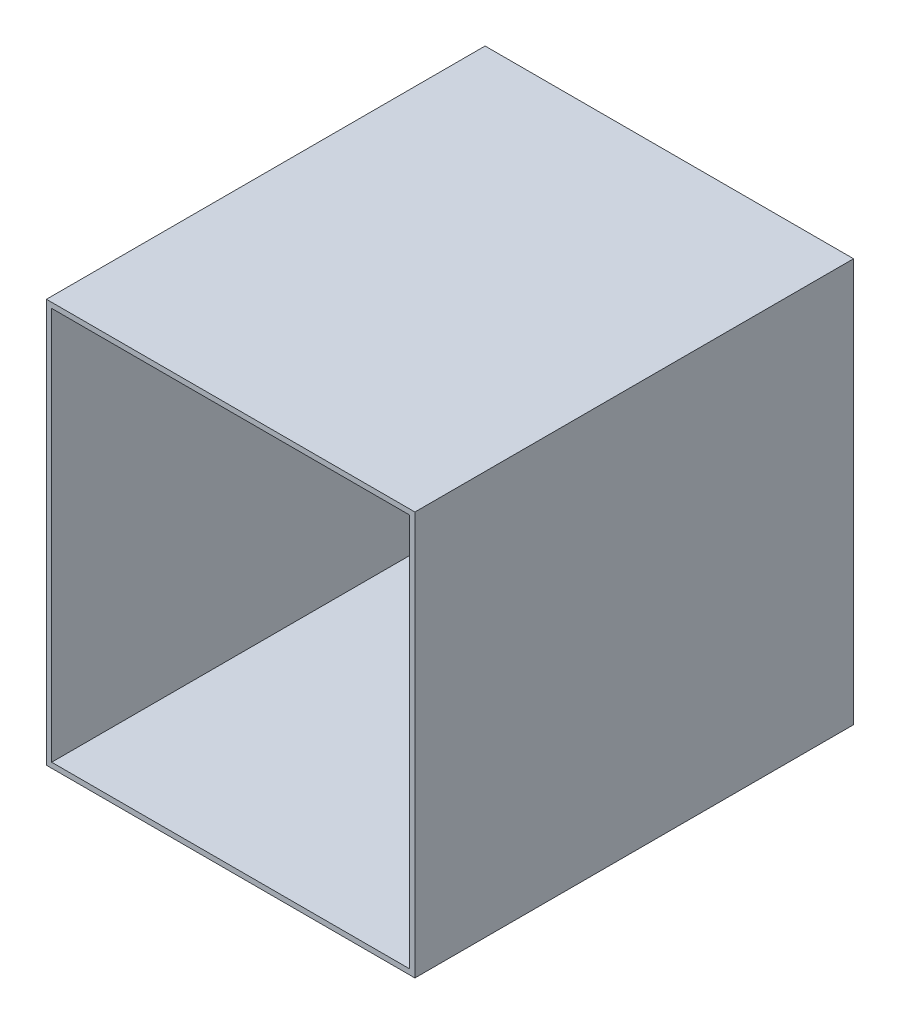
ISO-10303-21;
HEADER;
FILE_DESCRIPTION(('STEP AP214'),'2;1');
FILE_NAME('part.step','',(''),(''),'','','');
FILE_SCHEMA(('AUTOMOTIVE_DESIGN { 1 0 10303 214 1 1 1 1 }'));
ENDSEC;
DATA;
#1=APPLICATION_CONTEXT('core data for automotive mechanical design processes');
#2=APPLICATION_PROTOCOL_DEFINITION('international standard','automotive_design',2000,#1);
#3=PRODUCT_CONTEXT('',#1,'mechanical');
#4=PRODUCT('Part','Part','',(#3));
#5=PRODUCT_RELATED_PRODUCT_CATEGORY('part','',(#4));
#6=PRODUCT_DEFINITION_FORMATION('','',#4);
#7=PRODUCT_DEFINITION_CONTEXT('part definition',#1,'design');
#8=PRODUCT_DEFINITION('design','',#6,#7);
#9=PRODUCT_DEFINITION_SHAPE('','',#8);
#10=(LENGTH_UNIT() NAMED_UNIT(*) SI_UNIT(.MILLI.,.METRE.));
#11=(NAMED_UNIT(*) PLANE_ANGLE_UNIT() SI_UNIT($,.RADIAN.));
#12=(NAMED_UNIT(*) SI_UNIT($,.STERADIAN.) SOLID_ANGLE_UNIT());
#13=UNCERTAINTY_MEASURE_WITH_UNIT(LENGTH_MEASURE(1.E-05),#10,'distance_accuracy_value','');
#14=(GEOMETRIC_REPRESENTATION_CONTEXT(3) GLOBAL_UNCERTAINTY_ASSIGNED_CONTEXT((#13)) GLOBAL_UNIT_ASSIGNED_CONTEXT((#10,
#11,#12)) REPRESENTATION_CONTEXT('',''));
#15=CARTESIAN_POINT('',(0.,0.,0.));
#16=DIRECTION('',(0.,0.,1.));
#17=DIRECTION('',(1.,0.,0.));
#18=AXIS2_PLACEMENT_3D('',#15,#16,#17);
#19=CARTESIAN_POINT('',(0.,0.,250.));
#20=DIRECTION('',(0.,0.,-1.));
#21=DIRECTION('',(-1.,0.,0.));
#22=AXIS2_PLACEMENT_3D('',#19,#20,#21);
#23=PLANE('',#22);
#24=DIRECTION('',(0.,-1.,0.));
#25=VECTOR('',#24,1.);
#26=CARTESIAN_POINT('',(-164.250162140998,0.,250.));
#27=LINE('',#26,#25);
#28=CARTESIAN_POINT('',(-164.250162140998,230.,250.));
#29=VERTEX_POINT('',#28);
#30=CARTESIAN_POINT('',(-164.250162140998,0.,250.));
#31=VERTEX_POINT('',#30);
#32=EDGE_CURVE('E133',#29,#31,#27,.T.);
#33=ORIENTED_EDGE('',*,*,#32,.T.);
#34=DIRECTION('',(1.,0.,0.));
#35=VECTOR('',#34,1.);
#36=CARTESIAN_POINT('',(-164.250162140998,0.,250.));
#37=LINE('',#36,#35);
#38=CARTESIAN_POINT('',(45.7498378590025,0.,250.));
#39=VERTEX_POINT('',#38);
#40=EDGE_CURVE('E136',#31,#39,#37,.T.);
#41=ORIENTED_EDGE('',*,*,#40,.T.);
#42=DIRECTION('',(0.,1.,0.));
#43=VECTOR('',#42,1.);
#44=CARTESIAN_POINT('',(45.7498378590024,230.,250.));
#45=LINE('',#44,#43);
#46=CARTESIAN_POINT('',(45.7498378590024,230.,250.));
#47=VERTEX_POINT('',#46);
#48=EDGE_CURVE('E139',#39,#47,#45,.T.);
#49=ORIENTED_EDGE('',*,*,#48,.T.);
#50=DIRECTION('',(-1.,0.,0.));
#51=VECTOR('',#50,1.);
#52=CARTESIAN_POINT('',(-164.250162140998,230.,250.));
#53=LINE('',#52,#51);
#54=EDGE_CURVE('E141',#47,#29,#53,.T.);
#55=ORIENTED_EDGE('',*,*,#54,.T.);
#56=EDGE_LOOP('',(#33,#41,#49,#55));
#57=FACE_BOUND('',#56,.T.);
#58=DIRECTION('',(0.,1.,0.));
#59=VECTOR('',#58,1.);
#60=CARTESIAN_POINT('',(42.7498378590024,227.,250.));
#61=LINE('',#60,#59);
#62=CARTESIAN_POINT('',(42.7498378590024,3.,250.));
#63=VERTEX_POINT('',#62);
#64=CARTESIAN_POINT('',(42.7498378590024,227.,250.));
#65=VERTEX_POINT('',#64);
#66=EDGE_CURVE('E97',#63,#65,#61,.T.);
#67=ORIENTED_EDGE('',*,*,#66,.F.);
#68=DIRECTION('',(1.,0.,0.));
#69=VECTOR('',#68,1.);
#70=CARTESIAN_POINT('',(42.7498378590024,3.,250.));
#71=LINE('',#70,#69);
#72=CARTESIAN_POINT('',(-161.250162140998,2.99999999999998,250.));
#73=VERTEX_POINT('',#72);
#74=EDGE_CURVE('E119',#73,#63,#71,.T.);
#75=ORIENTED_EDGE('',*,*,#74,.F.);
#76=DIRECTION('',(0.,-1.,0.));
#77=VECTOR('',#76,1.);
#78=CARTESIAN_POINT('',(-161.250162140998,2.99999999999998,250.));
#79=LINE('',#78,#77);
#80=CARTESIAN_POINT('',(-161.250162140998,227.,250.));
#81=VERTEX_POINT('',#80);
#82=EDGE_CURVE('E117',#81,#73,#79,.T.);
#83=ORIENTED_EDGE('',*,*,#82,.F.);
#84=DIRECTION('',(-1.,0.,0.));
#85=VECTOR('',#84,1.);
#86=CARTESIAN_POINT('',(-161.250162140998,227.,250.));
#87=LINE('',#86,#85);
#88=EDGE_CURVE('E105',#65,#81,#87,.T.);
#89=ORIENTED_EDGE('',*,*,#88,.F.);
#90=EDGE_LOOP('',(#67,#75,#83,#89));
#91=FACE_BOUND('',#90,.T.);
#92=ADVANCED_FACE('F32',(#57,#91),#23,.F.);
#93=CARTESIAN_POINT('',(0.,0.,0.));
#94=DIRECTION('',(0.,0.,-1.));
#95=DIRECTION('',(-1.,0.,0.));
#96=AXIS2_PLACEMENT_3D('',#93,#94,#95);
#97=PLANE('',#96);
#98=DIRECTION('',(0.,-1.,0.));
#99=VECTOR('',#98,1.);
#100=CARTESIAN_POINT('',(-164.250162140998,0.,0.));
#101=LINE('',#100,#99);
#102=CARTESIAN_POINT('',(-164.250162140998,230.,0.));
#103=VERTEX_POINT('',#102);
#104=CARTESIAN_POINT('',(-164.250162140998,0.,0.));
#105=VERTEX_POINT('',#104);
#106=EDGE_CURVE('E113',#103,#105,#101,.T.);
#107=ORIENTED_EDGE('',*,*,#106,.F.);
#108=DIRECTION('',(-1.,0.,0.));
#109=VECTOR('',#108,1.);
#110=CARTESIAN_POINT('',(-164.250162140998,230.,0.));
#111=LINE('',#110,#109);
#112=CARTESIAN_POINT('',(45.7498378590024,230.,0.));
#113=VERTEX_POINT('',#112);
#114=EDGE_CURVE('E137',#113,#103,#111,.T.);
#115=ORIENTED_EDGE('',*,*,#114,.F.);
#116=DIRECTION('',(0.,1.,0.));
#117=VECTOR('',#116,1.);
#118=CARTESIAN_POINT('',(45.7498378590024,230.,0.));
#119=LINE('',#118,#117);
#120=CARTESIAN_POINT('',(45.7498378590025,0.,0.));
#121=VERTEX_POINT('',#120);
#122=EDGE_CURVE('E148',#121,#113,#119,.T.);
#123=ORIENTED_EDGE('',*,*,#122,.F.);
#124=DIRECTION('',(1.,0.,0.));
#125=VECTOR('',#124,1.);
#126=CARTESIAN_POINT('',(-164.250162140998,0.,0.));
#127=LINE('',#126,#125);
#128=EDGE_CURVE('E146',#105,#121,#127,.T.);
#129=ORIENTED_EDGE('',*,*,#128,.F.);
#130=EDGE_LOOP('',(#107,#115,#123,#129));
#131=FACE_BOUND('',#130,.T.);
#132=DIRECTION('',(1.,0.,0.));
#133=VECTOR('',#132,1.);
#134=CARTESIAN_POINT('',(42.7498378590024,3.,0.));
#135=LINE('',#134,#133);
#136=CARTESIAN_POINT('',(-161.250162140998,2.99999999999998,0.));
#137=VERTEX_POINT('',#136);
#138=CARTESIAN_POINT('',(42.7498378590024,3.,0.));
#139=VERTEX_POINT('',#138);
#140=EDGE_CURVE('E106',#137,#139,#135,.T.);
#141=ORIENTED_EDGE('',*,*,#140,.T.);
#142=DIRECTION('',(0.,1.,0.));
#143=VECTOR('',#142,1.);
#144=CARTESIAN_POINT('',(42.7498378590024,227.,0.));
#145=LINE('',#144,#143);
#146=CARTESIAN_POINT('',(42.7498378590024,227.,0.));
#147=VERTEX_POINT('',#146);
#148=EDGE_CURVE('E55',#139,#147,#145,.T.);
#149=ORIENTED_EDGE('',*,*,#148,.T.);
#150=DIRECTION('',(-1.,0.,0.));
#151=VECTOR('',#150,1.);
#152=CARTESIAN_POINT('',(-161.250162140998,227.,0.));
#153=LINE('',#152,#151);
#154=CARTESIAN_POINT('',(-161.250162140998,227.,0.));
#155=VERTEX_POINT('',#154);
#156=EDGE_CURVE('E112',#147,#155,#153,.T.);
#157=ORIENTED_EDGE('',*,*,#156,.T.);
#158=DIRECTION('',(0.,-1.,0.));
#159=VECTOR('',#158,1.);
#160=CARTESIAN_POINT('',(-161.250162140998,2.99999999999998,0.));
#161=LINE('',#160,#159);
#162=EDGE_CURVE('E125',#155,#137,#161,.T.);
#163=ORIENTED_EDGE('',*,*,#162,.T.);
#164=EDGE_LOOP('',(#141,#149,#157,#163));
#165=FACE_BOUND('',#164,.T.);
#166=ADVANCED_FACE('F166',(#131,#165),#97,.T.);
#167=CARTESIAN_POINT('',(-164.250162140998,0.,250.));
#168=DIRECTION('',(1.,0.,0.));
#169=DIRECTION('',(0.,0.,-1.));
#170=AXIS2_PLACEMENT_3D('',#167,#168,#169);
#171=PLANE('',#170);
#172=ORIENTED_EDGE('',*,*,#106,.T.);
#173=DIRECTION('',(0.,0.,-1.));
#174=VECTOR('',#173,1.);
#175=CARTESIAN_POINT('',(-164.250162140998,0.,250.));
#176=LINE('',#175,#174);
#177=EDGE_CURVE('E11',#31,#105,#176,.T.);
#178=ORIENTED_EDGE('',*,*,#177,.F.);
#179=ORIENTED_EDGE('',*,*,#32,.F.);
#180=DIRECTION('',(0.,0.,-1.));
#181=VECTOR('',#180,1.);
#182=CARTESIAN_POINT('',(-164.250162140998,230.,250.));
#183=LINE('',#182,#181);
#184=EDGE_CURVE('E143',#29,#103,#183,.T.);
#185=ORIENTED_EDGE('',*,*,#184,.T.);
#186=EDGE_LOOP('',(#172,#178,#179,#185));
#187=FACE_BOUND('',#186,.T.);
#188=ADVANCED_FACE('F34',(#187),#171,.F.);
#189=CARTESIAN_POINT('',(-164.250162140998,0.,250.));
#190=DIRECTION('',(0.,1.,0.));
#191=DIRECTION('',(0.,0.,1.));
#192=AXIS2_PLACEMENT_3D('',#189,#190,#191);
#193=PLANE('',#192);
#194=ORIENTED_EDGE('',*,*,#128,.T.);
#195=DIRECTION('',(0.,0.,-1.));
#196=VECTOR('',#195,1.);
#197=CARTESIAN_POINT('',(45.7498378590025,0.,250.));
#198=LINE('',#197,#196);
#199=EDGE_CURVE('E40',#39,#121,#198,.T.);
#200=ORIENTED_EDGE('',*,*,#199,.F.);
#201=ORIENTED_EDGE('',*,*,#40,.F.);
#202=ORIENTED_EDGE('',*,*,#177,.T.);
#203=EDGE_LOOP('',(#194,#200,#201,#202));
#204=FACE_BOUND('',#203,.T.);
#205=ADVANCED_FACE('F176',(#204),#193,.F.);
#206=CARTESIAN_POINT('',(45.7498378590024,230.,250.));
#207=DIRECTION('',(-1.,0.,0.));
#208=DIRECTION('',(0.,-1.,0.));
#209=AXIS2_PLACEMENT_3D('',#206,#207,#208);
#210=PLANE('',#209);
#211=ORIENTED_EDGE('',*,*,#122,.T.);
#212=DIRECTION('',(0.,0.,-1.));
#213=VECTOR('',#212,1.);
#214=CARTESIAN_POINT('',(45.7498378590024,230.,250.));
#215=LINE('',#214,#213);
#216=EDGE_CURVE('E153',#47,#113,#215,.T.);
#217=ORIENTED_EDGE('',*,*,#216,.F.);
#218=ORIENTED_EDGE('',*,*,#48,.F.);
#219=ORIENTED_EDGE('',*,*,#199,.T.);
#220=EDGE_LOOP('',(#211,#217,#218,#219));
#221=FACE_BOUND('',#220,.T.);
#222=ADVANCED_FACE('F160',(#221),#210,.F.);
#223=CARTESIAN_POINT('',(-164.250162140998,230.,250.));
#224=DIRECTION('',(0.,-1.,0.));
#225=DIRECTION('',(0.,0.,-1.));
#226=AXIS2_PLACEMENT_3D('',#223,#224,#225);
#227=PLANE('',#226);
#228=ORIENTED_EDGE('',*,*,#114,.T.);
#229=ORIENTED_EDGE('',*,*,#184,.F.);
#230=ORIENTED_EDGE('',*,*,#54,.F.);
#231=ORIENTED_EDGE('',*,*,#216,.T.);
#232=EDGE_LOOP('',(#228,#229,#230,#231));
#233=FACE_BOUND('',#232,.T.);
#234=ADVANCED_FACE('F170',(#233),#227,.F.);
#235=CARTESIAN_POINT('',(42.7498378590024,227.,250.));
#236=DIRECTION('',(-1.,0.,0.));
#237=DIRECTION('',(0.,-1.,0.));
#238=AXIS2_PLACEMENT_3D('',#235,#236,#237);
#239=PLANE('',#238);
#240=ORIENTED_EDGE('',*,*,#148,.F.);
#241=DIRECTION('',(0.,0.,-1.));
#242=VECTOR('',#241,1.);
#243=CARTESIAN_POINT('',(42.7498378590024,3.,250.));
#244=LINE('',#243,#242);
#245=EDGE_CURVE('E101',#63,#139,#244,.T.);
#246=ORIENTED_EDGE('',*,*,#245,.F.);
#247=ORIENTED_EDGE('',*,*,#66,.T.);
#248=DIRECTION('',(0.,0.,-1.));
#249=VECTOR('',#248,1.);
#250=CARTESIAN_POINT('',(42.7498378590024,227.,250.));
#251=LINE('',#250,#249);
#252=EDGE_CURVE('E100',#65,#147,#251,.T.);
#253=ORIENTED_EDGE('',*,*,#252,.T.);
#254=EDGE_LOOP('',(#240,#246,#247,#253));
#255=FACE_BOUND('',#254,.T.);
#256=ADVANCED_FACE('F99',(#255),#239,.T.);
#257=CARTESIAN_POINT('',(-161.250162140998,227.,250.));
#258=DIRECTION('',(0.,-1.,0.));
#259=DIRECTION('',(0.,0.,-1.));
#260=AXIS2_PLACEMENT_3D('',#257,#258,#259);
#261=PLANE('',#260);
#262=ORIENTED_EDGE('',*,*,#156,.F.);
#263=ORIENTED_EDGE('',*,*,#252,.F.);
#264=ORIENTED_EDGE('',*,*,#88,.T.);
#265=DIRECTION('',(0.,0.,-1.));
#266=VECTOR('',#265,1.);
#267=CARTESIAN_POINT('',(-161.250162140998,227.,250.));
#268=LINE('',#267,#266);
#269=EDGE_CURVE('E114',#81,#155,#268,.T.);
#270=ORIENTED_EDGE('',*,*,#269,.T.);
#271=EDGE_LOOP('',(#262,#263,#264,#270));
#272=FACE_BOUND('',#271,.T.);
#273=ADVANCED_FACE('F109',(#272),#261,.T.);
#274=CARTESIAN_POINT('',(-161.250162140998,2.99999999999998,250.));
#275=DIRECTION('',(1.,0.,0.));
#276=DIRECTION('',(0.,0.,-1.));
#277=AXIS2_PLACEMENT_3D('',#274,#275,#276);
#278=PLANE('',#277);
#279=ORIENTED_EDGE('',*,*,#162,.F.);
#280=ORIENTED_EDGE('',*,*,#269,.F.);
#281=ORIENTED_EDGE('',*,*,#82,.T.);
#282=DIRECTION('',(0.,0.,-1.));
#283=VECTOR('',#282,1.);
#284=CARTESIAN_POINT('',(-161.250162140998,2.99999999999998,250.));
#285=LINE('',#284,#283);
#286=EDGE_CURVE('E47',#73,#137,#285,.T.);
#287=ORIENTED_EDGE('',*,*,#286,.T.);
#288=EDGE_LOOP('',(#279,#280,#281,#287));
#289=FACE_BOUND('',#288,.T.);
#290=ADVANCED_FACE('F199',(#289),#278,.T.);
#291=CARTESIAN_POINT('',(42.7498378590024,3.,250.));
#292=DIRECTION('',(0.,1.,0.));
#293=DIRECTION('',(-1.,0.,0.));
#294=AXIS2_PLACEMENT_3D('',#291,#292,#293);
#295=PLANE('',#294);
#296=ORIENTED_EDGE('',*,*,#140,.F.);
#297=ORIENTED_EDGE('',*,*,#286,.F.);
#298=ORIENTED_EDGE('',*,*,#74,.T.);
#299=ORIENTED_EDGE('',*,*,#245,.T.);
#300=EDGE_LOOP('',(#296,#297,#298,#299));
#301=FACE_BOUND('',#300,.T.);
#302=ADVANCED_FACE('F203',(#301),#295,.T.);
#303=CLOSED_SHELL('',(#92,#166,#188,#205,#222,#234,#256,#273,#290,#302));
#304=MANIFOLD_SOLID_BREP('B2',#303);
#305=ADVANCED_BREP_SHAPE_REPRESENTATION('',(#18,#304),#14);
#306=SHAPE_DEFINITION_REPRESENTATION(#9,#305);
ENDSEC;
END-ISO-10303-21;
